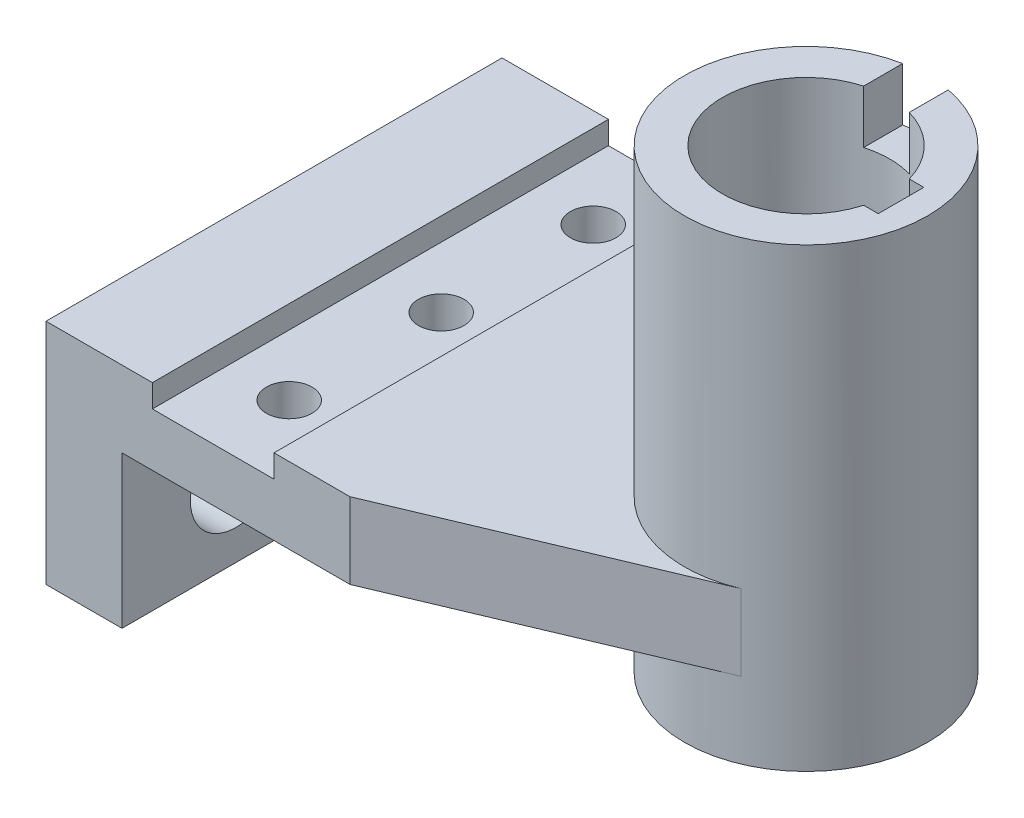
ISO-10303-21;
HEADER;
FILE_DESCRIPTION(('STEP AP214'),'2;1');
FILE_NAME('part.step','',(''),(''),'','','');
FILE_SCHEMA(('AUTOMOTIVE_DESIGN { 1 0 10303 214 1 1 1 1 }'));
ENDSEC;
DATA;
#1=APPLICATION_CONTEXT('core data for automotive mechanical design processes');
#2=APPLICATION_PROTOCOL_DEFINITION('international standard','automotive_design',2000,#1);
#3=PRODUCT_CONTEXT('',#1,'mechanical');
#4=PRODUCT('Part','Part','',(#3));
#5=PRODUCT_RELATED_PRODUCT_CATEGORY('part','',(#4));
#6=PRODUCT_DEFINITION_FORMATION('','',#4);
#7=PRODUCT_DEFINITION_CONTEXT('part definition',#1,'design');
#8=PRODUCT_DEFINITION('design','',#6,#7);
#9=PRODUCT_DEFINITION_SHAPE('','',#8);
#10=(LENGTH_UNIT() NAMED_UNIT(*) SI_UNIT(.MILLI.,.METRE.));
#11=(NAMED_UNIT(*) PLANE_ANGLE_UNIT() SI_UNIT($,.RADIAN.));
#12=(NAMED_UNIT(*) SI_UNIT($,.STERADIAN.) SOLID_ANGLE_UNIT());
#13=UNCERTAINTY_MEASURE_WITH_UNIT(LENGTH_MEASURE(1.E-05),#10,'distance_accuracy_value','');
#14=(GEOMETRIC_REPRESENTATION_CONTEXT(3) GLOBAL_UNCERTAINTY_ASSIGNED_CONTEXT((#13)) GLOBAL_UNIT_ASSIGNED_CONTEXT((#10,
#11,#12)) REPRESENTATION_CONTEXT('',''));
#15=CARTESIAN_POINT('',(0.,0.,0.));
#16=DIRECTION('',(0.,0.,1.));
#17=DIRECTION('',(1.,0.,0.));
#18=AXIS2_PLACEMENT_3D('',#15,#16,#17);
#19=CARTESIAN_POINT('',(37.3636363636364,-64.0080807491858,30.));
#20=DIRECTION('',(0.,1.,0.));
#21=DIRECTION('',(0.,0.,1.));
#22=AXIS2_PLACEMENT_3D('',#19,#20,#21);
#23=CYLINDRICAL_SURFACE('',#22,11.);
#24=CARTESIAN_POINT('',(37.3636363636364,44.2467532467532,30.));
#25=DIRECTION('',(0.,1.,0.));
#26=DIRECTION('',(0.,0.,1.));
#27=AXIS2_PLACEMENT_3D('',#24,#25,#26);
#28=CIRCLE('',#27,11.);
#29=CARTESIAN_POINT('',(34.3636363636364,44.2467532467532,19.4169947557416));
#30=VERTEX_POINT('',#29);
#31=CARTESIAN_POINT('',(40.3636363636364,44.2467532467532,19.4169947557416));
#32=VERTEX_POINT('',#31);
#33=EDGE_CURVE('E223',#30,#32,#28,.F.);
#34=ORIENTED_EDGE('',*,*,#33,.F.);
#35=DIRECTION('',(0.,1.,0.));
#36=VECTOR('',#35,1.);
#37=CARTESIAN_POINT('',(34.3636363636364,-64.0080807491858,19.4169947557416));
#38=LINE('',#37,#36);
#39=CARTESIAN_POINT('',(34.3636363636364,51.2467532467533,19.4169947557416));
#40=VERTEX_POINT('',#39);
#41=EDGE_CURVE('E230',#30,#40,#38,.T.);
#42=ORIENTED_EDGE('',*,*,#41,.T.);
#43=CARTESIAN_POINT('',(37.3636363636364,51.2467532467533,30.));
#44=DIRECTION('',(0.,1.,0.));
#45=DIRECTION('',(0.,0.,1.));
#46=AXIS2_PLACEMENT_3D('',#43,#44,#45);
#47=CIRCLE('',#46,11.);
#48=CARTESIAN_POINT('',(47.9466416078947,51.2467532467533,33.));
#49=VERTEX_POINT('',#48);
#50=EDGE_CURVE('E213',#40,#49,#47,.T.);
#51=ORIENTED_EDGE('',*,*,#50,.T.);
#52=DIRECTION('',(0.,1.,0.));
#53=VECTOR('',#52,1.);
#54=CARTESIAN_POINT('',(47.9466416078947,-64.0080807491858,33.));
#55=LINE('',#54,#53);
#56=CARTESIAN_POINT('',(47.9466416078947,-8.75324675324672,33.));
#57=VERTEX_POINT('',#56);
#58=EDGE_CURVE('E244',#57,#49,#55,.T.);
#59=ORIENTED_EDGE('',*,*,#58,.F.);
#60=CARTESIAN_POINT('',(37.3636363636364,-8.75324675324673,30.));
#61=DIRECTION('',(0.,-1.,0.));
#62=DIRECTION('',(1.,0.,0.));
#63=AXIS2_PLACEMENT_3D('',#60,#61,#62);
#64=CIRCLE('',#63,11.);
#65=CARTESIAN_POINT('',(47.9466416078947,-8.75324675324673,27.));
#66=VERTEX_POINT('',#65);
#67=EDGE_CURVE('E287',#66,#57,#64,.F.);
#68=ORIENTED_EDGE('',*,*,#67,.F.);
#69=DIRECTION('',(0.,1.,0.));
#70=VECTOR('',#69,1.);
#71=CARTESIAN_POINT('',(47.9466416078947,-64.0080807491858,27.));
#72=LINE('',#71,#70);
#73=CARTESIAN_POINT('',(47.9466416078947,51.2467532467533,27.));
#74=VERTEX_POINT('',#73);
#75=EDGE_CURVE('E258',#74,#66,#72,.F.);
#76=ORIENTED_EDGE('',*,*,#75,.F.);
#77=CARTESIAN_POINT('',(40.3636363636364,51.2467532467533,19.4169947557416));
#78=VERTEX_POINT('',#77);
#79=EDGE_CURVE('E209',#74,#78,#47,.T.);
#80=ORIENTED_EDGE('',*,*,#79,.T.);
#81=DIRECTION('',(0.,1.,0.));
#82=VECTOR('',#81,1.);
#83=CARTESIAN_POINT('',(40.3636363636364,-64.0080807491858,19.4169947557416));
#84=LINE('',#83,#82);
#85=EDGE_CURVE('E226',#32,#78,#84,.T.);
#86=ORIENTED_EDGE('',*,*,#85,.F.);
#87=EDGE_LOOP('',(#34,#42,#51,#59,#68,#76,#80,#86));
#88=FACE_BOUND('',#87,.T.);
#89=ADVANCED_FACE('F55',(#88),#23,.F.);
#90=CARTESIAN_POINT('',(-22.6363636363636,-8.75324675324675,60.));
#91=DIRECTION('',(0.,-1.,0.));
#92=DIRECTION('',(1.,0.,0.));
#93=AXIS2_PLACEMENT_3D('',#90,#91,#92);
#94=PLANE('',#93);
#95=CARTESIAN_POINT('',(37.3636363636364,-8.75324675324673,30.));
#96=DIRECTION('',(0.,-1.,0.));
#97=DIRECTION('',(1.,0.,0.));
#98=AXIS2_PLACEMENT_3D('',#95,#96,#97);
#99=CIRCLE('',#98,16.);
#100=CARTESIAN_POINT('',(53.3636363636364,-8.75324675324672,30.));
#101=VERTEX_POINT('',#100);
#102=EDGE_CURVE('E208',#101,#101,#99,.F.);
#103=ORIENTED_EDGE('',*,*,#102,.F.);
#104=EDGE_LOOP('',(#103));
#105=FACE_BOUND('',#104,.T.);
#106=DIRECTION('',(0.,0.,1.));
#107=VECTOR('',#106,1.);
#108=CARTESIAN_POINT('',(49.8636363636364,-8.75324675324672,27.));
#109=LINE('',#108,#107);
#110=CARTESIAN_POINT('',(49.8636363636364,-8.75324675324672,27.));
#111=VERTEX_POINT('',#110);
#112=CARTESIAN_POINT('',(49.8636363636363,-8.75324675324672,33.));
#113=VERTEX_POINT('',#112);
#114=EDGE_CURVE('E245',#111,#113,#109,.T.);
#115=ORIENTED_EDGE('',*,*,#114,.F.);
#116=DIRECTION('',(1.,0.,0.));
#117=VECTOR('',#116,1.);
#118=CARTESIAN_POINT('',(47.3849661318903,-8.75324675324673,27.));
#119=LINE('',#118,#117);
#120=EDGE_CURVE('E236',#66,#111,#119,.T.);
#121=ORIENTED_EDGE('',*,*,#120,.F.);
#122=ORIENTED_EDGE('',*,*,#67,.T.);
#123=DIRECTION('',(-1.,0.,0.));
#124=VECTOR('',#123,1.);
#125=CARTESIAN_POINT('',(49.8636363636363,-8.75324675324672,33.));
#126=LINE('',#125,#124);
#127=EDGE_CURVE('E241',#113,#57,#126,.T.);
#128=ORIENTED_EDGE('',*,*,#127,.F.);
#129=EDGE_LOOP('',(#115,#121,#122,#128));
#130=FACE_BOUND('',#129,.T.);
#131=ADVANCED_FACE('F474',(#105,#130),#94,.T.);
#132=CARTESIAN_POINT('',(0.,51.2467532467533,0.));
#133=DIRECTION('',(0.,1.,0.));
#134=DIRECTION('',(0.,0.,1.));
#135=AXIS2_PLACEMENT_3D('',#132,#133,#134);
#136=PLANE('',#135);
#137=DIRECTION('',(0.,0.,1.));
#138=VECTOR('',#137,1.);
#139=CARTESIAN_POINT('',(34.3636363636364,51.2467532467533,5.02033885702957));
#140=LINE('',#139,#138);
#141=CARTESIAN_POINT('',(34.3636363636364,51.2467532467533,14.2837663544983));
#142=VERTEX_POINT('',#141);
#143=EDGE_CURVE('E198',#142,#40,#140,.T.);
#144=ORIENTED_EDGE('',*,*,#143,.F.);
#145=CARTESIAN_POINT('',(37.3636363636364,51.2467532467533,30.));
#146=DIRECTION('',(0.,1.,0.));
#147=DIRECTION('',(0.,0.,1.));
#148=AXIS2_PLACEMENT_3D('',#145,#146,#147);
#149=CIRCLE('',#148,16.);
#150=CARTESIAN_POINT('',(40.3636363636364,51.2467532467533,14.2837663544983));
#151=VERTEX_POINT('',#150);
#152=EDGE_CURVE('E203',#142,#151,#149,.T.);
#153=ORIENTED_EDGE('',*,*,#152,.T.);
#154=DIRECTION('',(0.,0.,1.));
#155=VECTOR('',#154,1.);
#156=CARTESIAN_POINT('',(40.3636363636364,51.2467532467533,5.02033885702957));
#157=LINE('',#156,#155);
#158=EDGE_CURVE('E216',#151,#78,#157,.T.);
#159=ORIENTED_EDGE('',*,*,#158,.T.);
#160=ORIENTED_EDGE('',*,*,#79,.F.);
#161=DIRECTION('',(1.,0.,0.));
#162=VECTOR('',#161,1.);
#163=CARTESIAN_POINT('',(0.,51.2467532467533,27.));
#164=LINE('',#163,#162);
#165=CARTESIAN_POINT('',(49.8636363636364,51.2467532467533,27.));
#166=VERTEX_POINT('',#165);
#167=EDGE_CURVE('E444',#74,#166,#164,.T.);
#168=ORIENTED_EDGE('',*,*,#167,.T.);
#169=DIRECTION('',(0.,0.,1.));
#170=VECTOR('',#169,1.);
#171=CARTESIAN_POINT('',(49.8636363636364,51.2467532467533,27.));
#172=LINE('',#171,#170);
#173=CARTESIAN_POINT('',(49.8636363636363,51.2467532467533,33.));
#174=VERTEX_POINT('',#173);
#175=EDGE_CURVE('E238',#166,#174,#172,.T.);
#176=ORIENTED_EDGE('',*,*,#175,.T.);
#177=DIRECTION('',(-1.,0.,0.));
#178=VECTOR('',#177,1.);
#179=CARTESIAN_POINT('',(49.8636363636363,51.2467532467533,33.));
#180=LINE('',#179,#178);
#181=EDGE_CURVE('E79',#174,#49,#180,.T.);
#182=ORIENTED_EDGE('',*,*,#181,.T.);
#183=ORIENTED_EDGE('',*,*,#50,.F.);
#184=EDGE_LOOP('',(#144,#153,#159,#160,#168,#176,#182,#183));
#185=FACE_BOUND('',#184,.T.);
#186=ADVANCED_FACE('F211',(#185),#136,.T.);
#187=CARTESIAN_POINT('',(37.3636363636364,-64.0080807491858,30.));
#188=DIRECTION('',(0.,1.,0.));
#189=DIRECTION('',(0.,0.,1.));
#190=AXIS2_PLACEMENT_3D('',#187,#188,#189);
#191=CYLINDRICAL_SURFACE('',#190,16.);
#192=DIRECTION('',(0.,1.,0.));
#193=VECTOR('',#192,1.);
#194=CARTESIAN_POINT('',(34.3636363636364,-64.0080807491858,14.2837663544983));
#195=LINE('',#194,#193);
#196=CARTESIAN_POINT('',(34.3636363636364,44.2467532467532,14.2837663544983));
#197=VERTEX_POINT('',#196);
#198=EDGE_CURVE('E14',#197,#142,#195,.T.);
#199=ORIENTED_EDGE('',*,*,#198,.F.);
#200=CARTESIAN_POINT('',(37.3636363636364,44.2467532467532,30.));
#201=DIRECTION('',(0.,1.,0.));
#202=DIRECTION('',(0.,0.,1.));
#203=AXIS2_PLACEMENT_3D('',#200,#201,#202);
#204=CIRCLE('',#203,16.);
#205=CARTESIAN_POINT('',(40.3636363636364,44.2467532467532,14.2837663544983));
#206=VERTEX_POINT('',#205);
#207=EDGE_CURVE('E448',#197,#206,#204,.F.);
#208=ORIENTED_EDGE('',*,*,#207,.T.);
#209=DIRECTION('',(0.,1.,0.));
#210=VECTOR('',#209,1.);
#211=CARTESIAN_POINT('',(40.3636363636364,-64.0080807491858,14.2837663544983));
#212=LINE('',#211,#210);
#213=EDGE_CURVE('E64',#206,#151,#212,.T.);
#214=ORIENTED_EDGE('',*,*,#213,.T.);
#215=ORIENTED_EDGE('',*,*,#152,.F.);
#216=EDGE_LOOP('',(#199,#208,#214,#215));
#217=FACE_BOUND('',#216,.T.);
#218=ORIENTED_EDGE('',*,*,#102,.T.);
#219=EDGE_LOOP('',(#218));
#220=FACE_BOUND('',#219,.T.);
#221=CARTESIAN_POINT('',(37.3636363636364,11.2467532467532,30.));
#222=DIRECTION('',(0.,1.,0.));
#223=DIRECTION('',(0.,0.,1.));
#224=AXIS2_PLACEMENT_3D('',#221,#222,#223);
#225=CIRCLE('',#224,16.);
#226=CARTESIAN_POINT('',(43.5753071393102,11.2467532467532,15.2549958909928));
#227=VERTEX_POINT('',#226);
#228=CARTESIAN_POINT('',(43.5753071393102,11.2467532467532,44.7450041090072));
#229=VERTEX_POINT('',#228);
#230=EDGE_CURVE('E412',#227,#229,#225,.T.);
#231=ORIENTED_EDGE('',*,*,#230,.T.);
#232=DIRECTION('',(0.,1.,0.));
#233=VECTOR('',#232,1.);
#234=CARTESIAN_POINT('',(43.5753071393102,-34.0280964127481,44.7450041090072));
#235=LINE('',#234,#233);
#236=CARTESIAN_POINT('',(43.5753071393102,1.24675324675325,44.7450041090072));
#237=VERTEX_POINT('',#236);
#238=EDGE_CURVE('E266',#237,#229,#235,.T.);
#239=ORIENTED_EDGE('',*,*,#238,.F.);
#240=CARTESIAN_POINT('',(37.3636363636364,1.24675324675325,30.));
#241=DIRECTION('',(0.,-1.,0.));
#242=DIRECTION('',(1.,0.,0.));
#243=AXIS2_PLACEMENT_3D('',#240,#241,#242);
#244=CIRCLE('',#243,16.);
#245=CARTESIAN_POINT('',(43.5753071393102,1.24675324675325,15.2549958909928));
#246=VERTEX_POINT('',#245);
#247=EDGE_CURVE('E291',#237,#246,#244,.T.);
#248=ORIENTED_EDGE('',*,*,#247,.T.);
#249=DIRECTION('',(0.,1.,0.));
#250=VECTOR('',#249,1.);
#251=CARTESIAN_POINT('',(43.5753071393102,-34.0280964127481,15.2549958909928));
#252=LINE('',#251,#250);
#253=EDGE_CURVE('E262',#246,#227,#252,.T.);
#254=ORIENTED_EDGE('',*,*,#253,.T.);
#255=EDGE_LOOP('',(#231,#239,#248,#254));
#256=FACE_BOUND('',#255,.T.);
#257=ADVANCED_FACE('F204',(#217,#220,#256),#191,.T.);
#258=CARTESIAN_POINT('',(37.3636363636364,1.24675324675324,60.));
#259=DIRECTION('',(0.,-1.,0.));
#260=DIRECTION('',(1.,0.,0.));
#261=AXIS2_PLACEMENT_3D('',#258,#259,#260);
#262=PLANE('',#261);
#263=CARTESIAN_POINT('',(-10.6363636363636,1.24675324675324,50.));
#264=DIRECTION('',(0.,-1.,0.));
#265=DIRECTION('',(1.,0.,0.));
#266=AXIS2_PLACEMENT_3D('',#263,#264,#265);
#267=CIRCLE('',#266,3.);
#268=CARTESIAN_POINT('',(-7.63636363636364,1.24675324675324,50.));
#269=VERTEX_POINT('',#268);
#270=EDGE_CURVE('E303',#269,#269,#267,.F.);
#271=ORIENTED_EDGE('',*,*,#270,.T.);
#272=EDGE_LOOP('',(#271));
#273=FACE_BOUND('',#272,.T.);
#274=CARTESIAN_POINT('',(-10.6363636363636,1.24675324675324,10.));
#275=DIRECTION('',(0.,-1.,0.));
#276=DIRECTION('',(1.,0.,0.));
#277=AXIS2_PLACEMENT_3D('',#274,#275,#276);
#278=CIRCLE('',#277,3.);
#279=CARTESIAN_POINT('',(-7.63636363636363,1.24675324675324,10.));
#280=VERTEX_POINT('',#279);
#281=EDGE_CURVE('E309',#280,#280,#278,.F.);
#282=ORIENTED_EDGE('',*,*,#281,.T.);
#283=EDGE_LOOP('',(#282));
#284=FACE_BOUND('',#283,.T.);
#285=CARTESIAN_POINT('',(-10.6363636363636,1.24675324675324,30.));
#286=DIRECTION('',(0.,-1.,0.));
#287=DIRECTION('',(1.,0.,0.));
#288=AXIS2_PLACEMENT_3D('',#285,#286,#287);
#289=CIRCLE('',#288,3.);
#290=CARTESIAN_POINT('',(-7.63636363636363,1.24675324675324,30.));
#291=VERTEX_POINT('',#290);
#292=EDGE_CURVE('E298',#291,#291,#289,.F.);
#293=ORIENTED_EDGE('',*,*,#292,.T.);
#294=EDGE_LOOP('',(#293));
#295=FACE_BOUND('',#294,.T.);
#296=ORIENTED_EDGE('',*,*,#247,.F.);
#297=DIRECTION('',(-0.92156275681295,0.,0.388229423479617));
#298=VECTOR('',#297,1.);
#299=CARTESIAN_POINT('',(32.8419738059769,1.24675324675324,49.2666666666667));
#300=LINE('',#299,#298);
#301=CARTESIAN_POINT('',(7.36363636363636,1.24675324675324,60.));
#302=VERTEX_POINT('',#301);
#303=EDGE_CURVE('E280',#237,#302,#300,.T.);
#304=ORIENTED_EDGE('',*,*,#303,.T.);
#305=DIRECTION('',(-1.,0.,0.));
#306=VECTOR('',#305,1.);
#307=CARTESIAN_POINT('',(37.3636363636364,1.24675324675324,60.));
#308=LINE('',#307,#306);
#309=CARTESIAN_POINT('',(-22.6363636363636,1.24675324675324,60.));
#310=VERTEX_POINT('',#309);
#311=EDGE_CURVE('E363',#302,#310,#308,.T.);
#312=ORIENTED_EDGE('',*,*,#311,.T.);
#313=DIRECTION('',(0.,0.,-1.));
#314=VECTOR('',#313,1.);
#315=CARTESIAN_POINT('',(-22.6363636363636,1.24675324675324,60.));
#316=LINE('',#315,#314);
#317=CARTESIAN_POINT('',(-22.6363636363636,1.24675324675324,0.));
#318=VERTEX_POINT('',#317);
#319=EDGE_CURVE('E416',#310,#318,#316,.T.);
#320=ORIENTED_EDGE('',*,*,#319,.T.);
#321=DIRECTION('',(-1.,0.,0.));
#322=VECTOR('',#321,1.);
#323=CARTESIAN_POINT('',(37.3636363636364,1.24675324675324,0.));
#324=LINE('',#323,#322);
#325=CARTESIAN_POINT('',(7.36363636363637,1.24675324675324,0.));
#326=VERTEX_POINT('',#325);
#327=EDGE_CURVE('E398',#326,#318,#324,.T.);
#328=ORIENTED_EDGE('',*,*,#327,.F.);
#329=DIRECTION('',(0.92156275681295,0.,0.388229423479616));
#330=VECTOR('',#329,1.);
#331=CARTESIAN_POINT('',(54.3086404726436,1.24675324675325,19.7766584486522));
#332=LINE('',#331,#330);
#333=EDGE_CURVE('E274',#326,#246,#332,.T.);
#334=ORIENTED_EDGE('',*,*,#333,.T.);
#335=EDGE_LOOP('',(#296,#304,#312,#320,#328,#334));
#336=FACE_BOUND('',#335,.T.);
#337=ADVANCED_FACE('F488',(#273,#284,#295,#336),#262,.T.);
#338=CARTESIAN_POINT('',(-2.63636363636365,11.2467532467532,60.));
#339=DIRECTION('',(0.,1.,0.));
#340=DIRECTION('',(0.,0.,1.));
#341=AXIS2_PLACEMENT_3D('',#338,#339,#340);
#342=PLANE('',#341);
#343=DIRECTION('',(1.,0.,0.));
#344=VECTOR('',#343,1.);
#345=CARTESIAN_POINT('',(-2.63636363636365,11.2467532467532,60.));
#346=LINE('',#345,#344);
#347=CARTESIAN_POINT('',(-2.63636363636365,11.2467532467532,60.));
#348=VERTEX_POINT('',#347);
#349=CARTESIAN_POINT('',(7.36363636363635,11.2467532467532,60.));
#350=VERTEX_POINT('',#349);
#351=EDGE_CURVE('E359',#348,#350,#346,.T.);
#352=ORIENTED_EDGE('',*,*,#351,.T.);
#353=DIRECTION('',(0.92156275681295,0.,-0.388229423479617));
#354=VECTOR('',#353,1.);
#355=CARTESIAN_POINT('',(-1.12914278381049,11.2467532467532,63.5777777777778));
#356=LINE('',#355,#354);
#357=EDGE_CURVE('E277',#350,#229,#356,.T.);
#358=ORIENTED_EDGE('',*,*,#357,.T.);
#359=ORIENTED_EDGE('',*,*,#230,.F.);
#360=DIRECTION('',(-0.92156275681295,0.,-0.388229423479616));
#361=VECTOR('',#360,1.);
#362=CARTESIAN_POINT('',(20.3375238828562,11.2467532467532,5.46554733754114));
#363=LINE('',#362,#361);
#364=CARTESIAN_POINT('',(7.36363636363637,11.2467532467532,0.));
#365=VERTEX_POINT('',#364);
#366=EDGE_CURVE('E270',#227,#365,#363,.T.);
#367=ORIENTED_EDGE('',*,*,#366,.T.);
#368=DIRECTION('',(1.,0.,0.));
#369=VECTOR('',#368,1.);
#370=CARTESIAN_POINT('',(-2.63636363636363,11.2467532467532,0.));
#371=LINE('',#370,#369);
#372=CARTESIAN_POINT('',(-2.63636363636363,11.2467532467532,0.));
#373=VERTEX_POINT('',#372);
#374=EDGE_CURVE('E394',#373,#365,#371,.T.);
#375=ORIENTED_EDGE('',*,*,#374,.F.);
#376=DIRECTION('',(0.,0.,-1.));
#377=VECTOR('',#376,1.);
#378=CARTESIAN_POINT('',(-2.63636363636365,11.2467532467532,60.));
#379=LINE('',#378,#377);
#380=EDGE_CURVE('E420',#348,#373,#379,.T.);
#381=ORIENTED_EDGE('',*,*,#380,.F.);
#382=EDGE_LOOP('',(#352,#358,#359,#367,#375,#381));
#383=FACE_BOUND('',#382,.T.);
#384=ADVANCED_FACE('F516',(#383),#342,.T.);
#385=CARTESIAN_POINT('',(0.,0.,60.));
#386=DIRECTION('',(0.,0.,-1.));
#387=DIRECTION('',(-1.,0.,0.));
#388=AXIS2_PLACEMENT_3D('',#385,#386,#387);
#389=PLANE('',#388);
#390=DIRECTION('',(0.,-1.,0.));
#391=VECTOR('',#390,1.);
#392=CARTESIAN_POINT('',(7.36363636363635,0.,60.));
#393=LINE('',#392,#391);
#394=EDGE_CURVE('E441',#350,#302,#393,.T.);
#395=ORIENTED_EDGE('',*,*,#394,.F.);
#396=ORIENTED_EDGE('',*,*,#351,.F.);
#397=DIRECTION('',(0.,1.,0.));
#398=VECTOR('',#397,1.);
#399=CARTESIAN_POINT('',(-2.63636363636365,8.24675324675325,60.));
#400=LINE('',#399,#398);
#401=CARTESIAN_POINT('',(-2.63636363636365,8.24675324675325,60.));
#402=VERTEX_POINT('',#401);
#403=EDGE_CURVE('E356',#402,#348,#400,.T.);
#404=ORIENTED_EDGE('',*,*,#403,.F.);
#405=DIRECTION('',(1.,0.,0.));
#406=VECTOR('',#405,1.);
#407=CARTESIAN_POINT('',(-18.6363636363636,8.24675324675325,60.));
#408=LINE('',#407,#406);
#409=CARTESIAN_POINT('',(-18.6363636363636,8.24675324675325,60.));
#410=VERTEX_POINT('',#409);
#411=EDGE_CURVE('E352',#410,#402,#408,.T.);
#412=ORIENTED_EDGE('',*,*,#411,.F.);
#413=DIRECTION('',(0.,-1.,0.));
#414=VECTOR('',#413,1.);
#415=CARTESIAN_POINT('',(-18.6363636363636,11.2467532467532,60.));
#416=LINE('',#415,#414);
#417=CARTESIAN_POINT('',(-18.6363636363636,11.2467532467532,60.));
#418=VERTEX_POINT('',#417);
#419=EDGE_CURVE('E348',#418,#410,#416,.T.);
#420=ORIENTED_EDGE('',*,*,#419,.F.);
#421=DIRECTION('',(1.,0.,0.));
#422=VECTOR('',#421,1.);
#423=CARTESIAN_POINT('',(-32.6363636363636,11.2467532467532,60.));
#424=LINE('',#423,#422);
#425=CARTESIAN_POINT('',(-32.6363636363636,11.2467532467532,60.));
#426=VERTEX_POINT('',#425);
#427=EDGE_CURVE('E343',#426,#418,#424,.T.);
#428=ORIENTED_EDGE('',*,*,#427,.F.);
#429=DIRECTION('',(0.,1.,0.));
#430=VECTOR('',#429,1.);
#431=CARTESIAN_POINT('',(-32.6363636363636,-18.7532467532468,60.));
#432=LINE('',#431,#430);
#433=CARTESIAN_POINT('',(-32.6363636363636,-18.7532467532468,60.));
#434=VERTEX_POINT('',#433);
#435=EDGE_CURVE('E339',#434,#426,#432,.T.);
#436=ORIENTED_EDGE('',*,*,#435,.F.);
#437=DIRECTION('',(-1.,0.,0.));
#438=VECTOR('',#437,1.);
#439=CARTESIAN_POINT('',(-22.6363636363636,-18.7532467532467,60.));
#440=LINE('',#439,#438);
#441=CARTESIAN_POINT('',(-22.6363636363636,-18.7532467532467,60.));
#442=VERTEX_POINT('',#441);
#443=EDGE_CURVE('E371',#442,#434,#440,.T.);
#444=ORIENTED_EDGE('',*,*,#443,.F.);
#445=DIRECTION('',(0.,-1.,0.));
#446=VECTOR('',#445,1.);
#447=CARTESIAN_POINT('',(-22.6363636363636,1.24675324675324,60.));
#448=LINE('',#447,#446);
#449=EDGE_CURVE('E367',#310,#442,#448,.T.);
#450=ORIENTED_EDGE('',*,*,#449,.F.);
#451=ORIENTED_EDGE('',*,*,#311,.F.);
#452=EDGE_LOOP('',(#395,#396,#404,#412,#420,#428,#436,#444,#450,#451));
#453=FACE_BOUND('',#452,.T.);
#454=ADVANCED_FACE('F512',(#453),#389,.F.);
#455=CARTESIAN_POINT('',(0.,0.,0.));
#456=DIRECTION('',(0.,0.,-1.));
#457=DIRECTION('',(-1.,0.,0.));
#458=AXIS2_PLACEMENT_3D('',#455,#456,#457);
#459=PLANE('',#458);
#460=ORIENTED_EDGE('',*,*,#374,.T.);
#461=DIRECTION('',(0.,-1.,0.));
#462=VECTOR('',#461,1.);
#463=CARTESIAN_POINT('',(7.36363636363637,0.,0.));
#464=LINE('',#463,#462);
#465=EDGE_CURVE('E438',#365,#326,#464,.T.);
#466=ORIENTED_EDGE('',*,*,#465,.T.);
#467=ORIENTED_EDGE('',*,*,#327,.T.);
#468=DIRECTION('',(0.,-1.,0.));
#469=VECTOR('',#468,1.);
#470=CARTESIAN_POINT('',(-22.6363636363636,1.24675324675324,0.));
#471=LINE('',#470,#469);
#472=CARTESIAN_POINT('',(-22.6363636363636,-18.7532467532467,0.));
#473=VERTEX_POINT('',#472);
#474=EDGE_CURVE('E402',#318,#473,#471,.T.);
#475=ORIENTED_EDGE('',*,*,#474,.T.);
#476=DIRECTION('',(-1.,0.,0.));
#477=VECTOR('',#476,1.);
#478=CARTESIAN_POINT('',(-22.6363636363636,-18.7532467532467,0.));
#479=LINE('',#478,#477);
#480=CARTESIAN_POINT('',(-32.6363636363636,-18.7532467532468,0.));
#481=VERTEX_POINT('',#480);
#482=EDGE_CURVE('E344',#473,#481,#479,.T.);
#483=ORIENTED_EDGE('',*,*,#482,.T.);
#484=DIRECTION('',(0.,1.,0.));
#485=VECTOR('',#484,1.);
#486=CARTESIAN_POINT('',(-32.6363636363636,-18.7532467532468,0.));
#487=LINE('',#486,#485);
#488=CARTESIAN_POINT('',(-32.6363636363636,11.2467532467532,0.));
#489=VERTEX_POINT('',#488);
#490=EDGE_CURVE('E332',#481,#489,#487,.T.);
#491=ORIENTED_EDGE('',*,*,#490,.T.);
#492=DIRECTION('',(1.,0.,0.));
#493=VECTOR('',#492,1.);
#494=CARTESIAN_POINT('',(-32.6363636363636,11.2467532467532,0.));
#495=LINE('',#494,#493);
#496=CARTESIAN_POINT('',(-18.6363636363636,11.2467532467532,0.));
#497=VERTEX_POINT('',#496);
#498=EDGE_CURVE('E379',#489,#497,#495,.T.);
#499=ORIENTED_EDGE('',*,*,#498,.T.);
#500=DIRECTION('',(0.,-1.,0.));
#501=VECTOR('',#500,1.);
#502=CARTESIAN_POINT('',(-18.6363636363636,11.2467532467532,0.));
#503=LINE('',#502,#501);
#504=CARTESIAN_POINT('',(-18.6363636363636,8.24675324675325,0.));
#505=VERTEX_POINT('',#504);
#506=EDGE_CURVE('E383',#497,#505,#503,.T.);
#507=ORIENTED_EDGE('',*,*,#506,.T.);
#508=DIRECTION('',(1.,0.,0.));
#509=VECTOR('',#508,1.);
#510=CARTESIAN_POINT('',(-18.6363636363636,8.24675324675325,0.));
#511=LINE('',#510,#509);
#512=CARTESIAN_POINT('',(-2.63636363636363,8.24675324675325,0.));
#513=VERTEX_POINT('',#512);
#514=EDGE_CURVE('E387',#505,#513,#511,.T.);
#515=ORIENTED_EDGE('',*,*,#514,.T.);
#516=DIRECTION('',(0.,1.,0.));
#517=VECTOR('',#516,1.);
#518=CARTESIAN_POINT('',(-2.63636363636363,8.24675324675325,0.));
#519=LINE('',#518,#517);
#520=EDGE_CURVE('E391',#513,#373,#519,.T.);
#521=ORIENTED_EDGE('',*,*,#520,.T.);
#522=EDGE_LOOP('',(#460,#466,#467,#475,#483,#491,#499,#507,#515,#521));
#523=FACE_BOUND('',#522,.T.);
#524=ADVANCED_FACE('F515',(#523),#459,.T.);
#525=CARTESIAN_POINT('',(-32.6363636363636,-18.7532467532468,60.));
#526=DIRECTION('',(-1.,0.,0.));
#527=DIRECTION('',(0.,0.,1.));
#528=AXIS2_PLACEMENT_3D('',#525,#526,#527);
#529=PLANE('',#528);
#530=CARTESIAN_POINT('',(-32.6363636363636,-8.75324675324675,15.));
#531=DIRECTION('',(-1.,0.,0.));
#532=DIRECTION('',(0.,0.,1.));
#533=AXIS2_PLACEMENT_3D('',#530,#531,#532);
#534=CIRCLE('',#533,6.);
#535=CARTESIAN_POINT('',(-32.6363636363636,-8.75324675324675,21.));
#536=VERTEX_POINT('',#535);
#537=EDGE_CURVE('E323',#536,#536,#534,.T.);
#538=ORIENTED_EDGE('',*,*,#537,.F.);
#539=EDGE_LOOP('',(#538));
#540=FACE_BOUND('',#539,.T.);
#541=CARTESIAN_POINT('',(-32.6363636363636,-8.75324675324675,45.));
#542=DIRECTION('',(-1.,0.,0.));
#543=DIRECTION('',(0.,0.,1.));
#544=AXIS2_PLACEMENT_3D('',#541,#542,#543);
#545=CIRCLE('',#544,6.);
#546=CARTESIAN_POINT('',(-32.6363636363636,-8.75324675324675,51.));
#547=VERTEX_POINT('',#546);
#548=EDGE_CURVE('E328',#547,#547,#545,.T.);
#549=ORIENTED_EDGE('',*,*,#548,.F.);
#550=EDGE_LOOP('',(#549));
#551=FACE_BOUND('',#550,.T.);
#552=ORIENTED_EDGE('',*,*,#490,.F.);
#553=DIRECTION('',(0.,0.,-1.));
#554=VECTOR('',#553,1.);
#555=CARTESIAN_POINT('',(-32.6363636363636,-18.7532467532468,60.));
#556=LINE('',#555,#554);
#557=EDGE_CURVE('E409',#434,#481,#556,.T.);
#558=ORIENTED_EDGE('',*,*,#557,.F.);
#559=ORIENTED_EDGE('',*,*,#435,.T.);
#560=DIRECTION('',(0.,0.,-1.));
#561=VECTOR('',#560,1.);
#562=CARTESIAN_POINT('',(-32.6363636363636,11.2467532467532,60.));
#563=LINE('',#562,#561);
#564=EDGE_CURVE('E375',#426,#489,#563,.T.);
#565=ORIENTED_EDGE('',*,*,#564,.T.);
#566=EDGE_LOOP('',(#552,#558,#559,#565));
#567=FACE_BOUND('',#566,.T.);
#568=ADVANCED_FACE('F57',(#540,#551,#567),#529,.T.);
#569=CARTESIAN_POINT('',(-22.6363636363636,-18.7532467532467,60.));
#570=DIRECTION('',(0.,-1.,0.));
#571=DIRECTION('',(1.,0.,0.));
#572=AXIS2_PLACEMENT_3D('',#569,#570,#571);
#573=PLANE('',#572);
#574=ORIENTED_EDGE('',*,*,#482,.F.);
#575=DIRECTION('',(0.,0.,-1.));
#576=VECTOR('',#575,1.);
#577=CARTESIAN_POINT('',(-22.6363636363636,-18.7532467532467,60.));
#578=LINE('',#577,#576);
#579=EDGE_CURVE('E413',#442,#473,#578,.T.);
#580=ORIENTED_EDGE('',*,*,#579,.F.);
#581=ORIENTED_EDGE('',*,*,#443,.T.);
#582=ORIENTED_EDGE('',*,*,#557,.T.);
#583=EDGE_LOOP('',(#574,#580,#581,#582));
#584=FACE_BOUND('',#583,.T.);
#585=ADVANCED_FACE('F521',(#584),#573,.T.);
#586=CARTESIAN_POINT('',(-22.6363636363636,1.24675324675324,60.));
#587=DIRECTION('',(1.,0.,0.));
#588=DIRECTION('',(0.,1.,0.));
#589=AXIS2_PLACEMENT_3D('',#586,#587,#588);
#590=PLANE('',#589);
#591=CARTESIAN_POINT('',(-22.6363636363636,-8.75324675324675,15.));
#592=DIRECTION('',(1.,0.,0.));
#593=DIRECTION('',(0.,1.,0.));
#594=AXIS2_PLACEMENT_3D('',#591,#592,#593);
#595=CIRCLE('',#594,6.);
#596=CARTESIAN_POINT('',(-22.6363636363636,-2.75324675324676,15.));
#597=VERTEX_POINT('',#596);
#598=EDGE_CURVE('E327',#597,#597,#595,.F.);
#599=ORIENTED_EDGE('',*,*,#598,.T.);
#600=EDGE_LOOP('',(#599));
#601=FACE_BOUND('',#600,.T.);
#602=CARTESIAN_POINT('',(-22.6363636363636,-8.75324675324675,45.));
#603=DIRECTION('',(1.,0.,0.));
#604=DIRECTION('',(0.,1.,0.));
#605=AXIS2_PLACEMENT_3D('',#602,#603,#604);
#606=CIRCLE('',#605,6.);
#607=CARTESIAN_POINT('',(-22.6363636363636,-2.75324675324675,45.));
#608=VERTEX_POINT('',#607);
#609=EDGE_CURVE('E308',#608,#608,#606,.F.);
#610=ORIENTED_EDGE('',*,*,#609,.T.);
#611=EDGE_LOOP('',(#610));
#612=FACE_BOUND('',#611,.T.);
#613=ORIENTED_EDGE('',*,*,#474,.F.);
#614=ORIENTED_EDGE('',*,*,#319,.F.);
#615=ORIENTED_EDGE('',*,*,#449,.T.);
#616=ORIENTED_EDGE('',*,*,#579,.T.);
#617=EDGE_LOOP('',(#613,#614,#615,#616));
#618=FACE_BOUND('',#617,.T.);
#619=ADVANCED_FACE('F524',(#601,#612,#618),#590,.T.);
#620=CARTESIAN_POINT('',(-2.63636363636365,8.24675324675325,60.));
#621=DIRECTION('',(-1.,0.,0.));
#622=DIRECTION('',(0.,0.,1.));
#623=AXIS2_PLACEMENT_3D('',#620,#621,#622);
#624=PLANE('',#623);
#625=ORIENTED_EDGE('',*,*,#520,.F.);
#626=DIRECTION('',(0.,0.,-1.));
#627=VECTOR('',#626,1.);
#628=CARTESIAN_POINT('',(-2.63636363636365,8.24675324675325,60.));
#629=LINE('',#628,#627);
#630=EDGE_CURVE('E424',#402,#513,#629,.T.);
#631=ORIENTED_EDGE('',*,*,#630,.F.);
#632=ORIENTED_EDGE('',*,*,#403,.T.);
#633=ORIENTED_EDGE('',*,*,#380,.T.);
#634=EDGE_LOOP('',(#625,#631,#632,#633));
#635=FACE_BOUND('',#634,.T.);
#636=ADVANCED_FACE('F528',(#635),#624,.T.);
#637=CARTESIAN_POINT('',(-18.6363636363636,8.24675324675325,60.));
#638=DIRECTION('',(0.,1.,0.));
#639=DIRECTION('',(0.,0.,1.));
#640=AXIS2_PLACEMENT_3D('',#637,#638,#639);
#641=PLANE('',#640);
#642=CARTESIAN_POINT('',(-10.6363636363636,8.24675324675325,50.));
#643=DIRECTION('',(0.,1.,0.));
#644=DIRECTION('',(0.,0.,1.));
#645=AXIS2_PLACEMENT_3D('',#642,#643,#644);
#646=CIRCLE('',#645,3.);
#647=CARTESIAN_POINT('',(-10.6363636363636,8.24675324675325,53.));
#648=VERTEX_POINT('',#647);
#649=EDGE_CURVE('E299',#648,#648,#646,.T.);
#650=ORIENTED_EDGE('',*,*,#649,.F.);
#651=EDGE_LOOP('',(#650));
#652=FACE_BOUND('',#651,.T.);
#653=CARTESIAN_POINT('',(-10.6363636363636,8.24675324675325,10.));
#654=DIRECTION('',(0.,1.,0.));
#655=DIRECTION('',(0.,0.,1.));
#656=AXIS2_PLACEMENT_3D('',#653,#654,#655);
#657=CIRCLE('',#656,3.);
#658=CARTESIAN_POINT('',(-10.6363636363636,8.24675324675325,13.));
#659=VERTEX_POINT('',#658);
#660=EDGE_CURVE('E304',#659,#659,#657,.T.);
#661=ORIENTED_EDGE('',*,*,#660,.F.);
#662=EDGE_LOOP('',(#661));
#663=FACE_BOUND('',#662,.T.);
#664=CARTESIAN_POINT('',(-10.6363636363636,8.24675324675325,30.));
#665=DIRECTION('',(0.,1.,0.));
#666=DIRECTION('',(0.,0.,1.));
#667=AXIS2_PLACEMENT_3D('',#664,#665,#666);
#668=CIRCLE('',#667,3.);
#669=CARTESIAN_POINT('',(-10.6363636363636,8.24675324675325,33.));
#670=VERTEX_POINT('',#669);
#671=EDGE_CURVE('E313',#670,#670,#668,.T.);
#672=ORIENTED_EDGE('',*,*,#671,.F.);
#673=EDGE_LOOP('',(#672));
#674=FACE_BOUND('',#673,.T.);
#675=ORIENTED_EDGE('',*,*,#514,.F.);
#676=DIRECTION('',(0.,0.,-1.));
#677=VECTOR('',#676,1.);
#678=CARTESIAN_POINT('',(-18.6363636363636,8.24675324675325,60.));
#679=LINE('',#678,#677);
#680=EDGE_CURVE('E427',#410,#505,#679,.T.);
#681=ORIENTED_EDGE('',*,*,#680,.F.);
#682=ORIENTED_EDGE('',*,*,#411,.T.);
#683=ORIENTED_EDGE('',*,*,#630,.T.);
#684=EDGE_LOOP('',(#675,#681,#682,#683));
#685=FACE_BOUND('',#684,.T.);
#686=ADVANCED_FACE('F538',(#652,#663,#674,#685),#641,.T.);
#687=CARTESIAN_POINT('',(-18.6363636363636,11.2467532467532,60.));
#688=DIRECTION('',(1.,0.,0.));
#689=DIRECTION('',(0.,0.,-1.));
#690=AXIS2_PLACEMENT_3D('',#687,#688,#689);
#691=PLANE('',#690);
#692=ORIENTED_EDGE('',*,*,#506,.F.);
#693=DIRECTION('',(0.,0.,-1.));
#694=VECTOR('',#693,1.);
#695=CARTESIAN_POINT('',(-18.6363636363636,11.2467532467532,60.));
#696=LINE('',#695,#694);
#697=EDGE_CURVE('E430',#418,#497,#696,.T.);
#698=ORIENTED_EDGE('',*,*,#697,.F.);
#699=ORIENTED_EDGE('',*,*,#419,.T.);
#700=ORIENTED_EDGE('',*,*,#680,.T.);
#701=EDGE_LOOP('',(#692,#698,#699,#700));
#702=FACE_BOUND('',#701,.T.);
#703=ADVANCED_FACE('F542',(#702),#691,.T.);
#704=CARTESIAN_POINT('',(-32.6363636363636,11.2467532467532,60.));
#705=DIRECTION('',(0.,1.,0.));
#706=DIRECTION('',(0.,0.,1.));
#707=AXIS2_PLACEMENT_3D('',#704,#705,#706);
#708=PLANE('',#707);
#709=ORIENTED_EDGE('',*,*,#498,.F.);
#710=ORIENTED_EDGE('',*,*,#564,.F.);
#711=ORIENTED_EDGE('',*,*,#427,.T.);
#712=ORIENTED_EDGE('',*,*,#697,.T.);
#713=EDGE_LOOP('',(#709,#710,#711,#712));
#714=FACE_BOUND('',#713,.T.);
#715=ADVANCED_FACE('F510',(#714),#708,.T.);
#716=CARTESIAN_POINT('',(-5.66580088788649,-8.75324675324675,45.));
#717=DIRECTION('',(-1.,0.,0.));
#718=DIRECTION('',(0.,0.,1.));
#719=AXIS2_PLACEMENT_3D('',#716,#717,#718);
#720=CYLINDRICAL_SURFACE('',#719,6.);
#721=ORIENTED_EDGE('',*,*,#548,.T.);
#722=EDGE_LOOP('',(#721));
#723=FACE_BOUND('',#722,.T.);
#724=ORIENTED_EDGE('',*,*,#609,.F.);
#725=EDGE_LOOP('',(#724));
#726=FACE_BOUND('',#725,.T.);
#727=ADVANCED_FACE('F506',(#723,#726),#720,.F.);
#728=CARTESIAN_POINT('',(-5.66580088788648,-8.75324675324675,15.));
#729=DIRECTION('',(-1.,0.,0.));
#730=DIRECTION('',(0.,0.,1.));
#731=AXIS2_PLACEMENT_3D('',#728,#729,#730);
#732=CYLINDRICAL_SURFACE('',#731,6.);
#733=ORIENTED_EDGE('',*,*,#537,.T.);
#734=EDGE_LOOP('',(#733));
#735=FACE_BOUND('',#734,.T.);
#736=ORIENTED_EDGE('',*,*,#598,.F.);
#737=EDGE_LOOP('',(#736));
#738=FACE_BOUND('',#737,.T.);
#739=ADVANCED_FACE('F502',(#735,#738),#732,.F.);
#740=CARTESIAN_POINT('',(-10.6363636363636,-7.23852812748534,30.));
#741=DIRECTION('',(0.,1.,0.));
#742=DIRECTION('',(0.,0.,1.));
#743=AXIS2_PLACEMENT_3D('',#740,#741,#742);
#744=CYLINDRICAL_SURFACE('',#743,3.);
#745=ORIENTED_EDGE('',*,*,#671,.T.);
#746=EDGE_LOOP('',(#745));
#747=FACE_BOUND('',#746,.T.);
#748=ORIENTED_EDGE('',*,*,#292,.F.);
#749=EDGE_LOOP('',(#748));
#750=FACE_BOUND('',#749,.T.);
#751=ADVANCED_FACE('F498',(#747,#750),#744,.F.);
#752=CARTESIAN_POINT('',(-10.6363636363636,-7.23852812748534,10.));
#753=DIRECTION('',(0.,1.,0.));
#754=DIRECTION('',(0.,0.,1.));
#755=AXIS2_PLACEMENT_3D('',#752,#753,#754);
#756=CYLINDRICAL_SURFACE('',#755,3.);
#757=ORIENTED_EDGE('',*,*,#660,.T.);
#758=EDGE_LOOP('',(#757));
#759=FACE_BOUND('',#758,.T.);
#760=ORIENTED_EDGE('',*,*,#281,.F.);
#761=EDGE_LOOP('',(#760));
#762=FACE_BOUND('',#761,.T.);
#763=ADVANCED_FACE('F494',(#759,#762),#756,.F.);
#764=CARTESIAN_POINT('',(-10.6363636363636,-7.23852812748534,50.));
#765=DIRECTION('',(0.,1.,0.));
#766=DIRECTION('',(0.,0.,1.));
#767=AXIS2_PLACEMENT_3D('',#764,#765,#766);
#768=CYLINDRICAL_SURFACE('',#767,3.);
#769=ORIENTED_EDGE('',*,*,#649,.T.);
#770=EDGE_LOOP('',(#769));
#771=FACE_BOUND('',#770,.T.);
#772=ORIENTED_EDGE('',*,*,#270,.F.);
#773=EDGE_LOOP('',(#772));
#774=FACE_BOUND('',#773,.T.);
#775=ADVANCED_FACE('F490',(#771,#774),#768,.F.);
#776=CARTESIAN_POINT('',(1.10986262778914,51.2467532467533,-2.63454545454546));
#777=DIRECTION('',(0.388229423479617,0.,-0.92156275681295));
#778=DIRECTION('',(-0.92156275681295,0.,-0.388229423479616));
#779=AXIS2_PLACEMENT_3D('',#776,#777,#778);
#780=PLANE('',#779);
#781=ORIENTED_EDGE('',*,*,#465,.F.);
#782=ORIENTED_EDGE('',*,*,#366,.F.);
#783=ORIENTED_EDGE('',*,*,#253,.F.);
#784=ORIENTED_EDGE('',*,*,#333,.F.);
#785=EDGE_LOOP('',(#781,#782,#783,#784));
#786=FACE_BOUND('',#785,.T.);
#787=ADVANCED_FACE('F493',(#786),#780,.T.);
#788=CARTESIAN_POINT('',(22.5765292944558,-28.7532467532468,53.5912203392265));
#789=DIRECTION('',(0.388229423479617,0.,0.92156275681295));
#790=DIRECTION('',(0.92156275681295,0.,-0.388229423479617));
#791=AXIS2_PLACEMENT_3D('',#788,#789,#790);
#792=PLANE('',#791);
#793=ORIENTED_EDGE('',*,*,#303,.F.);
#794=ORIENTED_EDGE('',*,*,#238,.T.);
#795=ORIENTED_EDGE('',*,*,#357,.F.);
#796=ORIENTED_EDGE('',*,*,#394,.T.);
#797=EDGE_LOOP('',(#793,#794,#795,#796));
#798=FACE_BOUND('',#797,.T.);
#799=ADVANCED_FACE('F580',(#798),#792,.T.);
#800=CARTESIAN_POINT('',(47.3849661318903,-15.2450728536398,27.));
#801=DIRECTION('',(0.,0.,1.));
#802=DIRECTION('',(1.,0.,0.));
#803=AXIS2_PLACEMENT_3D('',#800,#801,#802);
#804=PLANE('',#803);
#805=ORIENTED_EDGE('',*,*,#75,.T.);
#806=ORIENTED_EDGE('',*,*,#120,.T.);
#807=DIRECTION('',(0.,1.,0.));
#808=VECTOR('',#807,1.);
#809=CARTESIAN_POINT('',(49.8636363636364,-15.2450728536398,27.));
#810=LINE('',#809,#808);
#811=EDGE_CURVE('E233',#111,#166,#810,.T.);
#812=ORIENTED_EDGE('',*,*,#811,.T.);
#813=ORIENTED_EDGE('',*,*,#167,.F.);
#814=EDGE_LOOP('',(#805,#806,#812,#813));
#815=FACE_BOUND('',#814,.T.);
#816=ADVANCED_FACE('F465',(#815),#804,.T.);
#817=CARTESIAN_POINT('',(49.8636363636363,-15.2450728536398,33.));
#818=DIRECTION('',(0.,0.,-1.));
#819=DIRECTION('',(-1.,0.,0.));
#820=AXIS2_PLACEMENT_3D('',#817,#818,#819);
#821=PLANE('',#820);
#822=ORIENTED_EDGE('',*,*,#58,.T.);
#823=ORIENTED_EDGE('',*,*,#181,.F.);
#824=DIRECTION('',(0.,1.,0.));
#825=VECTOR('',#824,1.);
#826=CARTESIAN_POINT('',(49.8636363636363,-15.2450728536398,33.));
#827=LINE('',#826,#825);
#828=EDGE_CURVE('E237',#113,#174,#827,.T.);
#829=ORIENTED_EDGE('',*,*,#828,.F.);
#830=ORIENTED_EDGE('',*,*,#127,.T.);
#831=EDGE_LOOP('',(#822,#823,#829,#830));
#832=FACE_BOUND('',#831,.T.);
#833=ADVANCED_FACE('F472',(#832),#821,.T.);
#834=CARTESIAN_POINT('',(49.8636363636364,-15.2450728536398,27.));
#835=DIRECTION('',(-1.,0.,0.));
#836=DIRECTION('',(0.,0.,1.));
#837=AXIS2_PLACEMENT_3D('',#834,#835,#836);
#838=PLANE('',#837);
#839=ORIENTED_EDGE('',*,*,#114,.T.);
#840=ORIENTED_EDGE('',*,*,#828,.T.);
#841=ORIENTED_EDGE('',*,*,#175,.F.);
#842=ORIENTED_EDGE('',*,*,#811,.F.);
#843=EDGE_LOOP('',(#839,#840,#841,#842));
#844=FACE_BOUND('',#843,.T.);
#845=ADVANCED_FACE('F469',(#844),#838,.T.);
#846=CARTESIAN_POINT('',(34.3636363636364,44.2467532467533,5.02033885702957));
#847=DIRECTION('',(-1.,0.,0.));
#848=DIRECTION('',(0.,0.,1.));
#849=AXIS2_PLACEMENT_3D('',#846,#847,#848);
#850=PLANE('',#849);
#851=DIRECTION('',(0.,0.,1.));
#852=VECTOR('',#851,1.);
#853=CARTESIAN_POINT('',(34.3636363636364,44.2467532467533,5.02033885702957));
#854=LINE('',#853,#852);
#855=EDGE_CURVE('E199',#197,#30,#854,.T.);
#856=ORIENTED_EDGE('',*,*,#855,.F.);
#857=ORIENTED_EDGE('',*,*,#198,.T.);
#858=ORIENTED_EDGE('',*,*,#143,.T.);
#859=ORIENTED_EDGE('',*,*,#41,.F.);
#860=EDGE_LOOP('',(#856,#857,#858,#859));
#861=FACE_BOUND('',#860,.T.);
#862=ADVANCED_FACE('F195',(#861),#850,.F.);
#863=CARTESIAN_POINT('',(40.3636363636364,44.2467532467533,5.02033885702957));
#864=DIRECTION('',(-1.,0.,0.));
#865=DIRECTION('',(0.,0.,1.));
#866=AXIS2_PLACEMENT_3D('',#863,#864,#865);
#867=PLANE('',#866);
#868=ORIENTED_EDGE('',*,*,#85,.T.);
#869=ORIENTED_EDGE('',*,*,#158,.F.);
#870=ORIENTED_EDGE('',*,*,#213,.F.);
#871=DIRECTION('',(0.,0.,1.));
#872=VECTOR('',#871,1.);
#873=CARTESIAN_POINT('',(40.3636363636364,44.2467532467533,5.02033885702957));
#874=LINE('',#873,#872);
#875=EDGE_CURVE('E71',#206,#32,#874,.T.);
#876=ORIENTED_EDGE('',*,*,#875,.T.);
#877=EDGE_LOOP('',(#868,#869,#870,#876));
#878=FACE_BOUND('',#877,.T.);
#879=ADVANCED_FACE('F461',(#878),#867,.T.);
#880=CARTESIAN_POINT('',(0.,44.2467532467533,0.));
#881=DIRECTION('',(0.,1.,0.));
#882=DIRECTION('',(0.,0.,1.));
#883=AXIS2_PLACEMENT_3D('',#880,#881,#882);
#884=PLANE('',#883);
#885=ORIENTED_EDGE('',*,*,#33,.T.);
#886=ORIENTED_EDGE('',*,*,#875,.F.);
#887=ORIENTED_EDGE('',*,*,#207,.F.);
#888=ORIENTED_EDGE('',*,*,#855,.T.);
#889=EDGE_LOOP('',(#885,#886,#887,#888));
#890=FACE_BOUND('',#889,.T.);
#891=ADVANCED_FACE('F454',(#890),#884,.T.);
#892=CLOSED_SHELL('',(#89,#131,#186,#257,#337,#384,#454,#524,#568,#585,#619,#636,#686,#703,#715,
#727,#739,#751,#763,#775,#787,#799,#816,#833,#845,#862,#879,#891));
#893=MANIFOLD_SOLID_BREP('B2',#892);
#894=ADVANCED_BREP_SHAPE_REPRESENTATION('',(#18,#893),#14);
#895=SHAPE_DEFINITION_REPRESENTATION(#9,#894);
ENDSEC;
END-ISO-10303-21;
